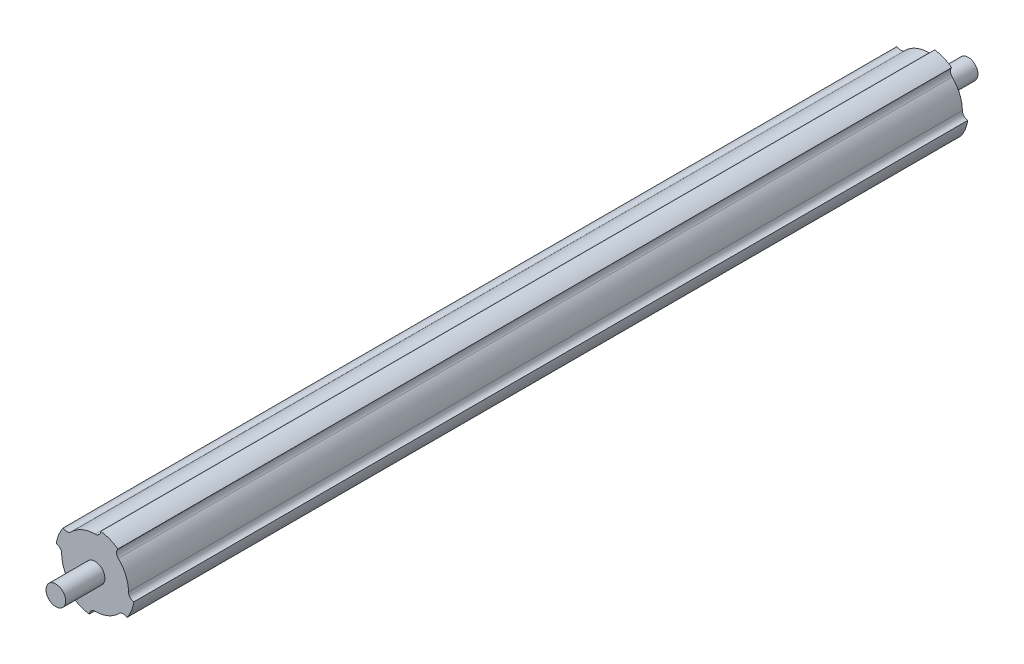
ISO-10303-21;
HEADER;
FILE_DESCRIPTION(('STEP AP214'),'2;1');
FILE_NAME('part.step','',(''),(''),'','','');
FILE_SCHEMA(('AUTOMOTIVE_DESIGN { 1 0 10303 214 1 1 1 1 }'));
ENDSEC;
DATA;
#1=APPLICATION_CONTEXT('core data for automotive mechanical design processes');
#2=APPLICATION_PROTOCOL_DEFINITION('international standard','automotive_design',2000,#1);
#3=PRODUCT_CONTEXT('',#1,'mechanical');
#4=PRODUCT('Part','Part','',(#3));
#5=PRODUCT_RELATED_PRODUCT_CATEGORY('part','',(#4));
#6=PRODUCT_DEFINITION_FORMATION('','',#4);
#7=PRODUCT_DEFINITION_CONTEXT('part definition',#1,'design');
#8=PRODUCT_DEFINITION('design','',#6,#7);
#9=PRODUCT_DEFINITION_SHAPE('','',#8);
#10=(LENGTH_UNIT() NAMED_UNIT(*) SI_UNIT(.MILLI.,.METRE.));
#11=(NAMED_UNIT(*) PLANE_ANGLE_UNIT() SI_UNIT($,.RADIAN.));
#12=(NAMED_UNIT(*) SI_UNIT($,.STERADIAN.) SOLID_ANGLE_UNIT());
#13=UNCERTAINTY_MEASURE_WITH_UNIT(LENGTH_MEASURE(1.E-05),#10,'distance_accuracy_value','');
#14=(GEOMETRIC_REPRESENTATION_CONTEXT(3) GLOBAL_UNCERTAINTY_ASSIGNED_CONTEXT((#13)) GLOBAL_UNIT_ASSIGNED_CONTEXT((#10,
#11,#12)) REPRESENTATION_CONTEXT('',''));
#15=CARTESIAN_POINT('',(0.,0.,0.));
#16=DIRECTION('',(0.,0.,1.));
#17=DIRECTION('',(1.,0.,0.));
#18=AXIS2_PLACEMENT_3D('',#15,#16,#17);
#19=CARTESIAN_POINT('',(0.,0.,590.55));
#20=DIRECTION('',(0.,0.,-1.));
#21=DIRECTION('',(-1.,0.,0.));
#22=AXIS2_PLACEMENT_3D('',#19,#20,#21);
#23=CYLINDRICAL_SURFACE('',#22,25.4);
#24=DIRECTION('',(0.,0.,-1.));
#25=VECTOR('',#24,1.);
#26=CARTESIAN_POINT('',(-3.75403689202122,-25.1210510730213,284.48));
#27=LINE('',#26,#25);
#28=CARTESIAN_POINT('',(-3.75403689202122,-25.1210510730213,565.15));
#29=VERTEX_POINT('',#28);
#30=CARTESIAN_POINT('',(-3.75403689202122,-25.1210510730213,25.4));
#31=VERTEX_POINT('',#30);
#32=EDGE_CURVE('E331',#29,#31,#27,.T.);
#33=ORIENTED_EDGE('',*,*,#32,.F.);
#34=CARTESIAN_POINT('',(0.,0.,565.15));
#35=DIRECTION('',(0.,0.,1.));
#36=DIRECTION('',(1.,0.,0.));
#37=AXIS2_PLACEMENT_3D('',#34,#35,#36);
#38=CIRCLE('',#37,25.4);
#39=CARTESIAN_POINT('',(-14.7680934050496,-20.6655127490157,565.15));
#40=VERTEX_POINT('',#39);
#41=EDGE_CURVE('E182',#40,#29,#38,.T.);
#42=ORIENTED_EDGE('',*,*,#41,.F.);
#43=DIRECTION('',(0.,0.,-1.));
#44=VECTOR('',#43,1.);
#45=CARTESIAN_POINT('',(-14.7680934050496,-20.6655127490157,295.275));
#46=LINE('',#45,#44);
#47=CARTESIAN_POINT('',(-14.7680934050496,-20.6655127490157,25.4));
#48=VERTEX_POINT('',#47);
#49=EDGE_CURVE('E322',#48,#40,#46,.F.);
#50=ORIENTED_EDGE('',*,*,#49,.F.);
#51=CARTESIAN_POINT('',(0.,0.,25.4));
#52=DIRECTION('',(0.,0.,1.));
#53=DIRECTION('',(1.,0.,0.));
#54=AXIS2_PLACEMENT_3D('',#51,#52,#53);
#55=CIRCLE('',#54,25.4);
#56=EDGE_CURVE('E342',#48,#31,#55,.T.);
#57=ORIENTED_EDGE('',*,*,#56,.T.);
#58=EDGE_LOOP('',(#33,#42,#50,#57));
#59=FACE_BOUND('',#58,.T.);
#60=ADVANCED_FACE('F51',(#59),#23,.T.);
#61=DIRECTION('',(0.,0.,-1.));
#62=VECTOR('',#61,1.);
#63=CARTESIAN_POINT('',(20.6655127490158,-14.7680934050494,295.275));
#64=LINE('',#63,#62);
#65=CARTESIAN_POINT('',(20.6655127490158,-14.7680934050494,25.4));
#66=VERTEX_POINT('',#65);
#67=CARTESIAN_POINT('',(20.6655127490158,-14.7680934050494,565.15));
#68=VERTEX_POINT('',#67);
#69=EDGE_CURVE('E228',#66,#68,#64,.F.);
#70=ORIENTED_EDGE('',*,*,#69,.F.);
#71=CARTESIAN_POINT('',(25.1210510730212,-3.75403689202148,25.4));
#72=VERTEX_POINT('',#71);
#73=EDGE_CURVE('E232',#66,#72,#55,.T.);
#74=ORIENTED_EDGE('',*,*,#73,.T.);
#75=DIRECTION('',(0.,0.,-1.));
#76=VECTOR('',#75,1.);
#77=CARTESIAN_POINT('',(25.1210510730212,-3.75403689202148,284.48));
#78=LINE('',#77,#76);
#79=CARTESIAN_POINT('',(25.1210510730212,-3.75403689202148,565.15));
#80=VERTEX_POINT('',#79);
#81=EDGE_CURVE('E231',#80,#72,#78,.T.);
#82=ORIENTED_EDGE('',*,*,#81,.F.);
#83=EDGE_CURVE('E188',#68,#80,#38,.T.);
#84=ORIENTED_EDGE('',*,*,#83,.F.);
#85=EDGE_LOOP('',(#70,#74,#82,#84));
#86=FACE_BOUND('',#85,.T.);
#87=ADVANCED_FACE('F227',(#86),#23,.T.);
#88=CARTESIAN_POINT('',(0.,0.,25.4));
#89=DIRECTION('',(0.,0.,1.));
#90=DIRECTION('',(1.,0.,0.));
#91=AXIS2_PLACEMENT_3D('',#88,#89,#90);
#92=PLANE('',#91);
#93=CARTESIAN_POINT('',(0.,0.,25.4));
#94=DIRECTION('',(0.,0.,1.));
#95=DIRECTION('',(1.,0.,0.));
#96=AXIS2_PLACEMENT_3D('',#93,#94,#95);
#97=CIRCLE('',#96,6.36193552466987);
#98=CARTESIAN_POINT('',(6.36193552466987,0.,25.4));
#99=VERTEX_POINT('',#98);
#100=EDGE_CURVE('E248',#99,#99,#97,.T.);
#101=ORIENTED_EDGE('',*,*,#100,.T.);
#102=EDGE_LOOP('',(#101));
#103=FACE_BOUND('',#102,.T.);
#104=CARTESIAN_POINT('',(2.75920760708765E-13,-25.4,25.4));
#105=DIRECTION('',(0.,0.,1.));
#106=DIRECTION('',(1.,0.,0.));
#107=AXIS2_PLACEMENT_3D('',#104,#105,#106);
#108=CIRCLE('',#107,3.76438646933613);
#109=CARTESIAN_POINT('',(2.35028147392977E-13,-21.6356135306639,25.4));
#110=VERTEX_POINT('',#109);
#111=EDGE_CURVE('E176',#31,#110,#108,.F.);
#112=ORIENTED_EDGE('',*,*,#111,.F.);
#113=ORIENTED_EDGE('',*,*,#56,.F.);
#114=CARTESIAN_POINT('',(-17.6602018083364,-18.2558832185362,25.4));
#115=DIRECTION('',(0.,0.,1.));
#116=DIRECTION('',(1.,0.,0.));
#117=AXIS2_PLACEMENT_3D('',#114,#115,#116);
#118=CIRCLE('',#117,3.76438646933613);
#119=CARTESIAN_POINT('',(-15.0428858739645,-15.5502848022512,25.4));
#120=VERTEX_POINT('',#119);
#121=EDGE_CURVE('E320',#120,#48,#118,.F.);
#122=ORIENTED_EDGE('',*,*,#121,.F.);
#123=CARTESIAN_POINT('',(0.,0.,25.4));
#124=DIRECTION('',(0.,0.,1.));
#125=DIRECTION('',(1.,0.,0.));
#126=AXIS2_PLACEMENT_3D('',#123,#124,#125);
#127=CIRCLE('',#126,21.6356135306639);
#128=CARTESIAN_POINT('',(-21.6356135306639,0.,25.4));
#129=VERTEX_POINT('',#128);
#130=EDGE_CURVE('E324',#129,#120,#127,.T.);
#131=ORIENTED_EDGE('',*,*,#130,.F.);
#132=CARTESIAN_POINT('',(-25.4,0.,25.4));
#133=DIRECTION('',(0.,0.,1.));
#134=DIRECTION('',(1.,0.,0.));
#135=AXIS2_PLACEMENT_3D('',#132,#133,#134);
#136=CIRCLE('',#135,3.76438646933613);
#137=CARTESIAN_POINT('',(-25.1210510730212,3.75403689202148,25.4));
#138=VERTEX_POINT('',#137);
#139=EDGE_CURVE('E316',#138,#129,#136,.F.);
#140=ORIENTED_EDGE('',*,*,#139,.F.);
#141=CARTESIAN_POINT('',(-20.6655127490157,14.7680934050495,25.4));
#142=VERTEX_POINT('',#141);
#143=EDGE_CURVE('E344',#142,#138,#55,.T.);
#144=ORIENTED_EDGE('',*,*,#143,.F.);
#145=CARTESIAN_POINT('',(-18.2558832185363,17.6602018083364,25.4));
#146=DIRECTION('',(0.,0.,1.));
#147=DIRECTION('',(1.,0.,0.));
#148=AXIS2_PLACEMENT_3D('',#145,#146,#147);
#149=CIRCLE('',#148,3.76438646933613);
#150=CARTESIAN_POINT('',(-15.5502848022513,15.0428858739644,25.4));
#151=VERTEX_POINT('',#150);
#152=EDGE_CURVE('E289',#151,#142,#149,.F.);
#153=ORIENTED_EDGE('',*,*,#152,.F.);
#154=CARTESIAN_POINT('',(0.,0.,25.4));
#155=DIRECTION('',(0.,0.,1.));
#156=DIRECTION('',(1.,0.,0.));
#157=AXIS2_PLACEMENT_3D('',#154,#155,#156);
#158=CIRCLE('',#157,21.6356135306639);
#159=CARTESIAN_POINT('',(0.,21.6356135306639,25.4));
#160=VERTEX_POINT('',#159);
#161=EDGE_CURVE('E308',#160,#151,#158,.T.);
#162=ORIENTED_EDGE('',*,*,#161,.F.);
#163=CARTESIAN_POINT('',(0.,25.4,25.4));
#164=DIRECTION('',(0.,0.,1.));
#165=DIRECTION('',(1.,0.,0.));
#166=AXIS2_PLACEMENT_3D('',#163,#164,#165);
#167=CIRCLE('',#166,3.76438646933613);
#168=CARTESIAN_POINT('',(3.75403689202139,25.1210510730213,25.4));
#169=VERTEX_POINT('',#168);
#170=EDGE_CURVE('E288',#169,#160,#167,.F.);
#171=ORIENTED_EDGE('',*,*,#170,.F.);
#172=CARTESIAN_POINT('',(14.7680934050496,20.6655127490157,25.4));
#173=VERTEX_POINT('',#172);
#174=EDGE_CURVE('E197',#173,#169,#55,.T.);
#175=ORIENTED_EDGE('',*,*,#174,.F.);
#176=CARTESIAN_POINT('',(17.6602018083364,18.2558832185362,25.4));
#177=DIRECTION('',(0.,0.,1.));
#178=DIRECTION('',(1.,0.,0.));
#179=AXIS2_PLACEMENT_3D('',#176,#177,#178);
#180=CIRCLE('',#179,3.76438646933613);
#181=CARTESIAN_POINT('',(15.0428858739645,15.5502848022512,25.4));
#182=VERTEX_POINT('',#181);
#183=EDGE_CURVE('E236',#182,#173,#180,.F.);
#184=ORIENTED_EDGE('',*,*,#183,.F.);
#185=CARTESIAN_POINT('',(0.,0.,25.4));
#186=DIRECTION('',(0.,0.,1.));
#187=DIRECTION('',(1.,0.,0.));
#188=AXIS2_PLACEMENT_3D('',#185,#186,#187);
#189=CIRCLE('',#188,21.6356135306639);
#190=CARTESIAN_POINT('',(21.6356135306639,0.,25.4));
#191=VERTEX_POINT('',#190);
#192=EDGE_CURVE('E297',#191,#182,#189,.T.);
#193=ORIENTED_EDGE('',*,*,#192,.F.);
#194=CARTESIAN_POINT('',(25.4,0.,25.4));
#195=DIRECTION('',(0.,0.,1.));
#196=DIRECTION('',(1.,0.,0.));
#197=AXIS2_PLACEMENT_3D('',#194,#195,#196);
#198=CIRCLE('',#197,3.76438646933613);
#199=EDGE_CURVE('E235',#72,#191,#198,.F.);
#200=ORIENTED_EDGE('',*,*,#199,.F.);
#201=ORIENTED_EDGE('',*,*,#73,.F.);
#202=CARTESIAN_POINT('',(18.2558832185364,-17.6602018083362,25.4));
#203=DIRECTION('',(0.,0.,1.));
#204=DIRECTION('',(1.,0.,0.));
#205=AXIS2_PLACEMENT_3D('',#202,#203,#204);
#206=CIRCLE('',#205,3.76438646933613);
#207=CARTESIAN_POINT('',(15.5502848022514,-15.0428858739643,25.4));
#208=VERTEX_POINT('',#207);
#209=EDGE_CURVE('E333',#208,#66,#206,.F.);
#210=ORIENTED_EDGE('',*,*,#209,.F.);
#211=CARTESIAN_POINT('',(0.,0.,25.4));
#212=DIRECTION('',(0.,0.,1.));
#213=DIRECTION('',(1.,0.,0.));
#214=AXIS2_PLACEMENT_3D('',#211,#212,#213);
#215=CIRCLE('',#214,21.6356135306639);
#216=EDGE_CURVE('E336',#110,#208,#215,.T.);
#217=ORIENTED_EDGE('',*,*,#216,.F.);
#218=EDGE_LOOP('',(#112,#113,#122,#131,#140,#144,#153,#162,#171,#175,#184,#193,#200,#201,#210,#217));
#219=FACE_BOUND('',#218,.T.);
#220=ADVANCED_FACE('F272',(#103,#219),#92,.F.);
#221=CARTESIAN_POINT('',(0.,0.,565.15));
#222=DIRECTION('',(0.,0.,1.));
#223=DIRECTION('',(1.,0.,0.));
#224=AXIS2_PLACEMENT_3D('',#221,#222,#223);
#225=PLANE('',#224);
#226=CARTESIAN_POINT('',(0.,0.,565.15));
#227=DIRECTION('',(0.,0.,1.));
#228=DIRECTION('',(1.,0.,0.));
#229=AXIS2_PLACEMENT_3D('',#226,#227,#228);
#230=CIRCLE('',#229,6.37790763137687);
#231=CARTESIAN_POINT('',(6.37790763137687,0.,565.15));
#232=VERTEX_POINT('',#231);
#233=EDGE_CURVE('E192',#232,#232,#230,.T.);
#234=ORIENTED_EDGE('',*,*,#233,.F.);
#235=EDGE_LOOP('',(#234));
#236=FACE_BOUND('',#235,.T.);
#237=ORIENTED_EDGE('',*,*,#41,.T.);
#238=CARTESIAN_POINT('',(2.75920760708765E-13,-25.4,565.15));
#239=DIRECTION('',(0.,0.,1.));
#240=DIRECTION('',(1.,0.,0.));
#241=AXIS2_PLACEMENT_3D('',#238,#239,#240);
#242=CIRCLE('',#241,3.76438646933613);
#243=CARTESIAN_POINT('',(2.35028147392977E-13,-21.6356135306639,565.15));
#244=VERTEX_POINT('',#243);
#245=EDGE_CURVE('E13',#29,#244,#242,.F.);
#246=ORIENTED_EDGE('',*,*,#245,.T.);
#247=CARTESIAN_POINT('',(0.,0.,565.15));
#248=DIRECTION('',(0.,0.,1.));
#249=DIRECTION('',(1.,0.,0.));
#250=AXIS2_PLACEMENT_3D('',#247,#248,#249);
#251=CIRCLE('',#250,21.6356135306639);
#252=CARTESIAN_POINT('',(15.5502848022514,-15.0428858739643,565.15));
#253=VERTEX_POINT('',#252);
#254=EDGE_CURVE('E163',#244,#253,#251,.T.);
#255=ORIENTED_EDGE('',*,*,#254,.T.);
#256=CARTESIAN_POINT('',(18.2558832185364,-17.6602018083362,565.15));
#257=DIRECTION('',(0.,0.,1.));
#258=DIRECTION('',(1.,0.,0.));
#259=AXIS2_PLACEMENT_3D('',#256,#257,#258);
#260=CIRCLE('',#259,3.76438646933613);
#261=EDGE_CURVE('E59',#253,#68,#260,.F.);
#262=ORIENTED_EDGE('',*,*,#261,.T.);
#263=ORIENTED_EDGE('',*,*,#83,.T.);
#264=CARTESIAN_POINT('',(25.4,0.,565.15));
#265=DIRECTION('',(0.,0.,1.));
#266=DIRECTION('',(1.,0.,0.));
#267=AXIS2_PLACEMENT_3D('',#264,#265,#266);
#268=CIRCLE('',#267,3.76438646933613);
#269=CARTESIAN_POINT('',(21.6356135306639,0.,565.15));
#270=VERTEX_POINT('',#269);
#271=EDGE_CURVE('E205',#80,#270,#268,.F.);
#272=ORIENTED_EDGE('',*,*,#271,.T.);
#273=CARTESIAN_POINT('',(0.,0.,565.15));
#274=DIRECTION('',(0.,0.,1.));
#275=DIRECTION('',(1.,0.,0.));
#276=AXIS2_PLACEMENT_3D('',#273,#274,#275);
#277=CIRCLE('',#276,21.6356135306639);
#278=CARTESIAN_POINT('',(15.0428858739645,15.5502848022512,565.15));
#279=VERTEX_POINT('',#278);
#280=EDGE_CURVE('E199',#270,#279,#277,.T.);
#281=ORIENTED_EDGE('',*,*,#280,.T.);
#282=CARTESIAN_POINT('',(17.6602018083364,18.2558832185362,565.15));
#283=DIRECTION('',(0.,0.,1.));
#284=DIRECTION('',(1.,0.,0.));
#285=AXIS2_PLACEMENT_3D('',#282,#283,#284);
#286=CIRCLE('',#285,3.76438646933613);
#287=CARTESIAN_POINT('',(14.7680934050496,20.6655127490157,565.15));
#288=VERTEX_POINT('',#287);
#289=EDGE_CURVE('E202',#279,#288,#286,.F.);
#290=ORIENTED_EDGE('',*,*,#289,.T.);
#291=CARTESIAN_POINT('',(3.75403689202139,25.1210510730213,565.15));
#292=VERTEX_POINT('',#291);
#293=EDGE_CURVE('E191',#288,#292,#38,.T.);
#294=ORIENTED_EDGE('',*,*,#293,.T.);
#295=CARTESIAN_POINT('',(0.,25.4,565.15));
#296=DIRECTION('',(0.,0.,1.));
#297=DIRECTION('',(1.,0.,0.));
#298=AXIS2_PLACEMENT_3D('',#295,#296,#297);
#299=CIRCLE('',#298,3.76438646933613);
#300=CARTESIAN_POINT('',(0.,21.6356135306639,565.15));
#301=VERTEX_POINT('',#300);
#302=EDGE_CURVE('E214',#292,#301,#299,.F.);
#303=ORIENTED_EDGE('',*,*,#302,.T.);
#304=CARTESIAN_POINT('',(0.,0.,565.15));
#305=DIRECTION('',(0.,0.,1.));
#306=DIRECTION('',(1.,0.,0.));
#307=AXIS2_PLACEMENT_3D('',#304,#305,#306);
#308=CIRCLE('',#307,21.6356135306639);
#309=CARTESIAN_POINT('',(-15.5502848022513,15.0428858739644,565.15));
#310=VERTEX_POINT('',#309);
#311=EDGE_CURVE('E208',#301,#310,#308,.T.);
#312=ORIENTED_EDGE('',*,*,#311,.T.);
#313=CARTESIAN_POINT('',(-18.2558832185363,17.6602018083364,565.15));
#314=DIRECTION('',(0.,0.,1.));
#315=DIRECTION('',(1.,0.,0.));
#316=AXIS2_PLACEMENT_3D('',#313,#314,#315);
#317=CIRCLE('',#316,3.76438646933613);
#318=CARTESIAN_POINT('',(-20.6655127490157,14.7680934050495,565.15));
#319=VERTEX_POINT('',#318);
#320=EDGE_CURVE('E211',#310,#319,#317,.F.);
#321=ORIENTED_EDGE('',*,*,#320,.T.);
#322=CARTESIAN_POINT('',(-25.1210510730212,3.75403689202148,565.15));
#323=VERTEX_POINT('',#322);
#324=EDGE_CURVE('E187',#319,#323,#38,.T.);
#325=ORIENTED_EDGE('',*,*,#324,.T.);
#326=CARTESIAN_POINT('',(-25.4,0.,565.15));
#327=DIRECTION('',(0.,0.,1.));
#328=DIRECTION('',(1.,0.,0.));
#329=AXIS2_PLACEMENT_3D('',#326,#327,#328);
#330=CIRCLE('',#329,3.76438646933613);
#331=CARTESIAN_POINT('',(-21.6356135306639,0.,565.15));
#332=VERTEX_POINT('',#331);
#333=EDGE_CURVE('E170',#323,#332,#330,.F.);
#334=ORIENTED_EDGE('',*,*,#333,.T.);
#335=CARTESIAN_POINT('',(0.,0.,565.15));
#336=DIRECTION('',(0.,0.,1.));
#337=DIRECTION('',(1.,0.,0.));
#338=AXIS2_PLACEMENT_3D('',#335,#336,#337);
#339=CIRCLE('',#338,21.6356135306639);
#340=CARTESIAN_POINT('',(-15.0428858739645,-15.5502848022512,565.15));
#341=VERTEX_POINT('',#340);
#342=EDGE_CURVE('E217',#332,#341,#339,.T.);
#343=ORIENTED_EDGE('',*,*,#342,.T.);
#344=CARTESIAN_POINT('',(-17.6602018083364,-18.2558832185362,565.15));
#345=DIRECTION('',(0.,0.,1.));
#346=DIRECTION('',(1.,0.,0.));
#347=AXIS2_PLACEMENT_3D('',#344,#345,#346);
#348=CIRCLE('',#347,3.76438646933613);
#349=EDGE_CURVE('E184',#341,#40,#348,.F.);
#350=ORIENTED_EDGE('',*,*,#349,.T.);
#351=EDGE_LOOP('',(#237,#246,#255,#262,#263,#272,#281,#290,#294,#303,#312,#321,#325,#334,#343,#350));
#352=FACE_BOUND('',#351,.T.);
#353=ADVANCED_FACE('F179',(#236,#352),#225,.T.);
#354=DIRECTION('',(0.,0.,-1.));
#355=VECTOR('',#354,1.);
#356=CARTESIAN_POINT('',(-25.1210510730212,3.75403689202148,284.48));
#357=LINE('',#356,#355);
#358=EDGE_CURVE('E318',#323,#138,#357,.T.);
#359=ORIENTED_EDGE('',*,*,#358,.F.);
#360=ORIENTED_EDGE('',*,*,#324,.F.);
#361=DIRECTION('',(0.,0.,-1.));
#362=VECTOR('',#361,1.);
#363=CARTESIAN_POINT('',(-20.6655127490157,14.7680934050495,284.48));
#364=LINE('',#363,#362);
#365=EDGE_CURVE('E306',#142,#319,#364,.F.);
#366=ORIENTED_EDGE('',*,*,#365,.F.);
#367=ORIENTED_EDGE('',*,*,#143,.T.);
#368=EDGE_LOOP('',(#359,#360,#366,#367));
#369=FACE_BOUND('',#368,.T.);
#370=ADVANCED_FACE('F273',(#369),#23,.T.);
#371=DIRECTION('',(0.,0.,-1.));
#372=VECTOR('',#371,1.);
#373=CARTESIAN_POINT('',(3.75403689202139,25.1210510730213,284.48));
#374=LINE('',#373,#372);
#375=EDGE_CURVE('E283',#292,#169,#374,.T.);
#376=ORIENTED_EDGE('',*,*,#375,.F.);
#377=ORIENTED_EDGE('',*,*,#293,.F.);
#378=DIRECTION('',(0.,0.,-1.));
#379=VECTOR('',#378,1.);
#380=CARTESIAN_POINT('',(14.7680934050496,20.6655127490157,284.48));
#381=LINE('',#380,#379);
#382=EDGE_CURVE('E240',#173,#288,#381,.F.);
#383=ORIENTED_EDGE('',*,*,#382,.F.);
#384=ORIENTED_EDGE('',*,*,#174,.T.);
#385=EDGE_LOOP('',(#376,#377,#383,#384));
#386=FACE_BOUND('',#385,.T.);
#387=ADVANCED_FACE('F53',(#386),#23,.T.);
#388=CARTESIAN_POINT('',(0.,0.,25.4));
#389=DIRECTION('',(0.,0.,-1.));
#390=DIRECTION('',(-1.,0.,0.));
#391=AXIS2_PLACEMENT_3D('',#388,#389,#390);
#392=CYLINDRICAL_SURFACE('',#391,6.36193552466987);
#393=ORIENTED_EDGE('',*,*,#100,.F.);
#394=EDGE_LOOP('',(#393));
#395=FACE_BOUND('',#394,.T.);
#396=CARTESIAN_POINT('',(0.,0.,0.));
#397=DIRECTION('',(0.,0.,1.));
#398=DIRECTION('',(1.,0.,0.));
#399=AXIS2_PLACEMENT_3D('',#396,#397,#398);
#400=CIRCLE('',#399,6.36193552466987);
#401=CARTESIAN_POINT('',(6.36193552466987,0.,0.));
#402=VERTEX_POINT('',#401);
#403=EDGE_CURVE('E196',#402,#402,#400,.T.);
#404=ORIENTED_EDGE('',*,*,#403,.T.);
#405=EDGE_LOOP('',(#404));
#406=FACE_BOUND('',#405,.T.);
#407=ADVANCED_FACE('F253',(#395,#406),#392,.T.);
#408=CARTESIAN_POINT('',(0.,0.,0.));
#409=DIRECTION('',(0.,0.,1.));
#410=DIRECTION('',(1.,0.,0.));
#411=AXIS2_PLACEMENT_3D('',#408,#409,#410);
#412=PLANE('',#411);
#413=ORIENTED_EDGE('',*,*,#403,.F.);
#414=EDGE_LOOP('',(#413));
#415=FACE_BOUND('',#414,.T.);
#416=ADVANCED_FACE('F255',(#415),#412,.F.);
#417=CARTESIAN_POINT('',(0.,0.,565.15));
#418=DIRECTION('',(0.,0.,1.));
#419=DIRECTION('',(1.,0.,0.));
#420=AXIS2_PLACEMENT_3D('',#417,#418,#419);
#421=CYLINDRICAL_SURFACE('',#420,6.37790763137687);
#422=ORIENTED_EDGE('',*,*,#233,.T.);
#423=EDGE_LOOP('',(#422));
#424=FACE_BOUND('',#423,.T.);
#425=CARTESIAN_POINT('',(0.,0.,590.55));
#426=DIRECTION('',(0.,0.,1.));
#427=DIRECTION('',(1.,0.,0.));
#428=AXIS2_PLACEMENT_3D('',#425,#426,#427);
#429=CIRCLE('',#428,6.37790763137687);
#430=CARTESIAN_POINT('',(6.37790763137687,0.,590.55));
#431=VERTEX_POINT('',#430);
#432=EDGE_CURVE('E238',#431,#431,#429,.T.);
#433=ORIENTED_EDGE('',*,*,#432,.F.);
#434=EDGE_LOOP('',(#433));
#435=FACE_BOUND('',#434,.T.);
#436=ADVANCED_FACE('F257',(#424,#435),#421,.T.);
#437=CARTESIAN_POINT('',(0.,0.,590.55));
#438=DIRECTION('',(0.,0.,1.));
#439=DIRECTION('',(1.,0.,0.));
#440=AXIS2_PLACEMENT_3D('',#437,#438,#439);
#441=PLANE('',#440);
#442=ORIENTED_EDGE('',*,*,#432,.T.);
#443=EDGE_LOOP('',(#442));
#444=FACE_BOUND('',#443,.T.);
#445=ADVANCED_FACE('F262',(#444),#441,.T.);
#446=CARTESIAN_POINT('',(25.4,0.,568.96));
#447=DIRECTION('',(0.,0.,-1.));
#448=DIRECTION('',(-1.,0.,0.));
#449=AXIS2_PLACEMENT_3D('',#446,#447,#448);
#450=CYLINDRICAL_SURFACE('',#449,3.76438646933613);
#451=ORIENTED_EDGE('',*,*,#199,.T.);
#452=DIRECTION('',(0.,0.,-1.));
#453=VECTOR('',#452,1.);
#454=CARTESIAN_POINT('',(21.6356135306639,0.,568.96));
#455=LINE('',#454,#453);
#456=EDGE_CURVE('E301',#270,#191,#455,.T.);
#457=ORIENTED_EDGE('',*,*,#456,.F.);
#458=ORIENTED_EDGE('',*,*,#271,.F.);
#459=ORIENTED_EDGE('',*,*,#81,.T.);
#460=EDGE_LOOP('',(#451,#457,#458,#459));
#461=FACE_BOUND('',#460,.T.);
#462=ADVANCED_FACE('F380',(#461),#450,.F.);
#463=CARTESIAN_POINT('',(17.6602018083364,18.2558832185362,568.96));
#464=DIRECTION('',(0.,0.,-1.));
#465=DIRECTION('',(-1.,0.,0.));
#466=AXIS2_PLACEMENT_3D('',#463,#464,#465);
#467=CYLINDRICAL_SURFACE('',#466,3.76438646933613);
#468=ORIENTED_EDGE('',*,*,#183,.T.);
#469=ORIENTED_EDGE('',*,*,#382,.T.);
#470=ORIENTED_EDGE('',*,*,#289,.F.);
#471=DIRECTION('',(0.,0.,-1.));
#472=VECTOR('',#471,1.);
#473=CARTESIAN_POINT('',(15.0428858739645,15.5502848022512,568.96));
#474=LINE('',#473,#472);
#475=EDGE_CURVE('E295',#279,#182,#474,.T.);
#476=ORIENTED_EDGE('',*,*,#475,.T.);
#477=EDGE_LOOP('',(#468,#469,#470,#476));
#478=FACE_BOUND('',#477,.T.);
#479=ADVANCED_FACE('F294',(#478),#467,.F.);
#480=CARTESIAN_POINT('',(0.,0.,568.96));
#481=DIRECTION('',(0.,0.,-1.));
#482=DIRECTION('',(-1.,0.,0.));
#483=AXIS2_PLACEMENT_3D('',#480,#481,#482);
#484=CYLINDRICAL_SURFACE('',#483,21.6356135306639);
#485=ORIENTED_EDGE('',*,*,#192,.T.);
#486=ORIENTED_EDGE('',*,*,#475,.F.);
#487=ORIENTED_EDGE('',*,*,#280,.F.);
#488=ORIENTED_EDGE('',*,*,#456,.T.);
#489=EDGE_LOOP('',(#485,#486,#487,#488));
#490=FACE_BOUND('',#489,.T.);
#491=ADVANCED_FACE('F367',(#490),#484,.T.);
#492=CARTESIAN_POINT('',(0.,25.4,568.96));
#493=DIRECTION('',(0.,0.,-1.));
#494=DIRECTION('',(-1.,0.,0.));
#495=AXIS2_PLACEMENT_3D('',#492,#493,#494);
#496=CYLINDRICAL_SURFACE('',#495,3.76438646933613);
#497=ORIENTED_EDGE('',*,*,#170,.T.);
#498=DIRECTION('',(0.,0.,-1.));
#499=VECTOR('',#498,1.);
#500=CARTESIAN_POINT('',(0.,21.6356135306639,568.96));
#501=LINE('',#500,#499);
#502=EDGE_CURVE('E313',#301,#160,#501,.T.);
#503=ORIENTED_EDGE('',*,*,#502,.F.);
#504=ORIENTED_EDGE('',*,*,#302,.F.);
#505=ORIENTED_EDGE('',*,*,#375,.T.);
#506=EDGE_LOOP('',(#497,#503,#504,#505));
#507=FACE_BOUND('',#506,.T.);
#508=ADVANCED_FACE('F365',(#507),#496,.F.);
#509=CARTESIAN_POINT('',(-18.2558832185363,17.6602018083364,568.96));
#510=DIRECTION('',(0.,0.,-1.));
#511=DIRECTION('',(-1.,0.,0.));
#512=AXIS2_PLACEMENT_3D('',#509,#510,#511);
#513=CYLINDRICAL_SURFACE('',#512,3.76438646933613);
#514=ORIENTED_EDGE('',*,*,#152,.T.);
#515=ORIENTED_EDGE('',*,*,#365,.T.);
#516=ORIENTED_EDGE('',*,*,#320,.F.);
#517=DIRECTION('',(0.,0.,-1.));
#518=VECTOR('',#517,1.);
#519=CARTESIAN_POINT('',(-15.5502848022513,15.0428858739644,568.96));
#520=LINE('',#519,#518);
#521=EDGE_CURVE('E310',#310,#151,#520,.T.);
#522=ORIENTED_EDGE('',*,*,#521,.T.);
#523=EDGE_LOOP('',(#514,#515,#516,#522));
#524=FACE_BOUND('',#523,.T.);
#525=ADVANCED_FACE('F361',(#524),#513,.F.);
#526=CARTESIAN_POINT('',(0.,0.,568.96));
#527=DIRECTION('',(0.,0.,-1.));
#528=DIRECTION('',(-1.,0.,0.));
#529=AXIS2_PLACEMENT_3D('',#526,#527,#528);
#530=CYLINDRICAL_SURFACE('',#529,21.6356135306639);
#531=ORIENTED_EDGE('',*,*,#161,.T.);
#532=ORIENTED_EDGE('',*,*,#521,.F.);
#533=ORIENTED_EDGE('',*,*,#311,.F.);
#534=ORIENTED_EDGE('',*,*,#502,.T.);
#535=EDGE_LOOP('',(#531,#532,#533,#534));
#536=FACE_BOUND('',#535,.T.);
#537=ADVANCED_FACE('F363',(#536),#530,.T.);
#538=CARTESIAN_POINT('',(-25.4,0.,568.96));
#539=DIRECTION('',(0.,0.,-1.));
#540=DIRECTION('',(-1.,0.,0.));
#541=AXIS2_PLACEMENT_3D('',#538,#539,#540);
#542=CYLINDRICAL_SURFACE('',#541,3.76438646933613);
#543=ORIENTED_EDGE('',*,*,#139,.T.);
#544=DIRECTION('',(0.,0.,-1.));
#545=VECTOR('',#544,1.);
#546=CARTESIAN_POINT('',(-21.6356135306639,0.,568.96));
#547=LINE('',#546,#545);
#548=EDGE_CURVE('E327',#332,#129,#547,.T.);
#549=ORIENTED_EDGE('',*,*,#548,.F.);
#550=ORIENTED_EDGE('',*,*,#333,.F.);
#551=ORIENTED_EDGE('',*,*,#358,.T.);
#552=EDGE_LOOP('',(#543,#549,#550,#551));
#553=FACE_BOUND('',#552,.T.);
#554=ADVANCED_FACE('F357',(#553),#542,.F.);
#555=CARTESIAN_POINT('',(-17.6602018083364,-18.2558832185362,568.96));
#556=DIRECTION('',(0.,0.,-1.));
#557=DIRECTION('',(-1.,0.,0.));
#558=AXIS2_PLACEMENT_3D('',#555,#556,#557);
#559=CYLINDRICAL_SURFACE('',#558,3.76438646933613);
#560=ORIENTED_EDGE('',*,*,#121,.T.);
#561=ORIENTED_EDGE('',*,*,#49,.T.);
#562=ORIENTED_EDGE('',*,*,#349,.F.);
#563=DIRECTION('',(0.,0.,-1.));
#564=VECTOR('',#563,1.);
#565=CARTESIAN_POINT('',(-15.0428858739645,-15.5502848022512,568.96));
#566=LINE('',#565,#564);
#567=EDGE_CURVE('E74',#341,#120,#566,.T.);
#568=ORIENTED_EDGE('',*,*,#567,.T.);
#569=EDGE_LOOP('',(#560,#561,#562,#568));
#570=FACE_BOUND('',#569,.T.);
#571=ADVANCED_FACE('F466',(#570),#559,.F.);
#572=CARTESIAN_POINT('',(0.,0.,568.96));
#573=DIRECTION('',(0.,0.,-1.));
#574=DIRECTION('',(-1.,0.,0.));
#575=AXIS2_PLACEMENT_3D('',#572,#573,#574);
#576=CYLINDRICAL_SURFACE('',#575,21.6356135306639);
#577=ORIENTED_EDGE('',*,*,#130,.T.);
#578=ORIENTED_EDGE('',*,*,#567,.F.);
#579=ORIENTED_EDGE('',*,*,#342,.F.);
#580=ORIENTED_EDGE('',*,*,#548,.T.);
#581=EDGE_LOOP('',(#577,#578,#579,#580));
#582=FACE_BOUND('',#581,.T.);
#583=ADVANCED_FACE('F358',(#582),#576,.T.);
#584=CARTESIAN_POINT('',(2.75920760708765E-13,-25.4,568.96));
#585=DIRECTION('',(0.,0.,-1.));
#586=DIRECTION('',(-1.,0.,0.));
#587=AXIS2_PLACEMENT_3D('',#584,#585,#586);
#588=CYLINDRICAL_SURFACE('',#587,3.76438646933613);
#589=ORIENTED_EDGE('',*,*,#111,.T.);
#590=DIRECTION('',(0.,0.,-1.));
#591=VECTOR('',#590,1.);
#592=CARTESIAN_POINT('',(2.35028147392977E-13,-21.6356135306639,568.96));
#593=LINE('',#592,#591);
#594=EDGE_CURVE('E166',#244,#110,#593,.T.);
#595=ORIENTED_EDGE('',*,*,#594,.F.);
#596=ORIENTED_EDGE('',*,*,#245,.F.);
#597=ORIENTED_EDGE('',*,*,#32,.T.);
#598=EDGE_LOOP('',(#589,#595,#596,#597));
#599=FACE_BOUND('',#598,.T.);
#600=ADVANCED_FACE('F173',(#599),#588,.F.);
#601=CARTESIAN_POINT('',(18.2558832185364,-17.6602018083362,568.96));
#602=DIRECTION('',(0.,0.,-1.));
#603=DIRECTION('',(-1.,0.,0.));
#604=AXIS2_PLACEMENT_3D('',#601,#602,#603);
#605=CYLINDRICAL_SURFACE('',#604,3.76438646933613);
#606=ORIENTED_EDGE('',*,*,#209,.T.);
#607=ORIENTED_EDGE('',*,*,#69,.T.);
#608=ORIENTED_EDGE('',*,*,#261,.F.);
#609=DIRECTION('',(0.,0.,-1.));
#610=VECTOR('',#609,1.);
#611=CARTESIAN_POINT('',(15.5502848022514,-15.0428858739643,568.96));
#612=LINE('',#611,#610);
#613=EDGE_CURVE('E66',#253,#208,#612,.T.);
#614=ORIENTED_EDGE('',*,*,#613,.T.);
#615=EDGE_LOOP('',(#606,#607,#608,#614));
#616=FACE_BOUND('',#615,.T.);
#617=ADVANCED_FACE('F339',(#616),#605,.F.);
#618=CARTESIAN_POINT('',(0.,0.,568.96));
#619=DIRECTION('',(0.,0.,-1.));
#620=DIRECTION('',(-1.,0.,0.));
#621=AXIS2_PLACEMENT_3D('',#618,#619,#620);
#622=CYLINDRICAL_SURFACE('',#621,21.6356135306639);
#623=ORIENTED_EDGE('',*,*,#216,.T.);
#624=ORIENTED_EDGE('',*,*,#613,.F.);
#625=ORIENTED_EDGE('',*,*,#254,.F.);
#626=ORIENTED_EDGE('',*,*,#594,.T.);
#627=EDGE_LOOP('',(#623,#624,#625,#626));
#628=FACE_BOUND('',#627,.T.);
#629=ADVANCED_FACE('F165',(#628),#622,.T.);
#630=CLOSED_SHELL('',(#60,#87,#220,#353,#370,#387,#407,#416,#436,#445,#462,#479,#491,#508,#525,
#537,#554,#571,#583,#600,#617,#629));
#631=MANIFOLD_SOLID_BREP('B2',#630);
#632=ADVANCED_BREP_SHAPE_REPRESENTATION('',(#18,#631),#14);
#633=SHAPE_DEFINITION_REPRESENTATION(#9,#632);
ENDSEC;
END-ISO-10303-21;
